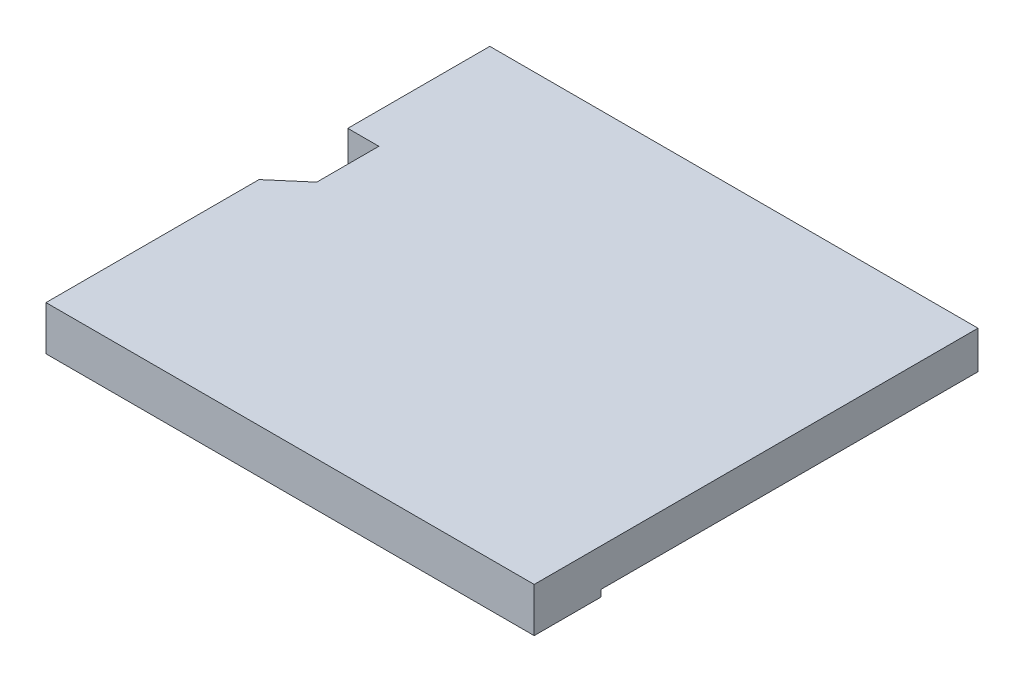
ISO-10303-21;
HEADER;
FILE_DESCRIPTION(('STEP AP214'),'2;1');
FILE_NAME('part.step','',(''),(''),'','','');
FILE_SCHEMA(('AUTOMOTIVE_DESIGN { 1 0 10303 214 1 1 1 1 }'));
ENDSEC;
DATA;
#1=APPLICATION_CONTEXT('core data for automotive mechanical design processes');
#2=APPLICATION_PROTOCOL_DEFINITION('international standard','automotive_design',2000,#1);
#3=PRODUCT_CONTEXT('',#1,'mechanical');
#4=PRODUCT('Part','Part','',(#3));
#5=PRODUCT_RELATED_PRODUCT_CATEGORY('part','',(#4));
#6=PRODUCT_DEFINITION_FORMATION('','',#4);
#7=PRODUCT_DEFINITION_CONTEXT('part definition',#1,'design');
#8=PRODUCT_DEFINITION('design','',#6,#7);
#9=PRODUCT_DEFINITION_SHAPE('','',#8);
#10=(LENGTH_UNIT() NAMED_UNIT(*) SI_UNIT(.MILLI.,.METRE.));
#11=(NAMED_UNIT(*) PLANE_ANGLE_UNIT() SI_UNIT($,.RADIAN.));
#12=(NAMED_UNIT(*) SI_UNIT($,.STERADIAN.) SOLID_ANGLE_UNIT());
#13=UNCERTAINTY_MEASURE_WITH_UNIT(LENGTH_MEASURE(1.E-05),#10,'distance_accuracy_value','');
#14=(GEOMETRIC_REPRESENTATION_CONTEXT(3) GLOBAL_UNCERTAINTY_ASSIGNED_CONTEXT((#13)) GLOBAL_UNIT_ASSIGNED_CONTEXT((#10,
#11,#12)) REPRESENTATION_CONTEXT('',''));
#15=CARTESIAN_POINT('',(0.,0.,0.));
#16=DIRECTION('',(0.,0.,1.));
#17=DIRECTION('',(1.,0.,0.));
#18=AXIS2_PLACEMENT_3D('',#15,#16,#17);
#19=CARTESIAN_POINT('',(-4.924999678405,-3.164426964218,10.));
#20=DIRECTION('',(0.,1.,0.));
#21=DIRECTION('',(0.,0.,1.));
#22=AXIS2_PLACEMENT_3D('',#19,#20,#21);
#23=PLANE('',#22);
#24=CARTESIAN_POINT('',(-0.574999732976,-3.164426964218,68.8750000000001));
#25=DIRECTION('',(0.,-1.,0.));
#26=DIRECTION('',(0.,0.,-1.));
#27=AXIS2_PLACEMENT_3D('',#24,#25,#26);
#28=CIRCLE('',#27,60.6250000000001);
#29=CARTESIAN_POINT('',(-6.074999732976,-3.164426964218,8.5));
#30=VERTEX_POINT('',#29);
#31=CARTESIAN_POINT('',(4.925000267024,-3.164426964218,8.5));
#32=VERTEX_POINT('',#31);
#33=EDGE_CURVE('E61',#30,#32,#28,.T.);
#34=ORIENTED_EDGE('',*,*,#33,.F.);
#35=DIRECTION('',(0.,0.,-1.));
#36=VECTOR('',#35,1.);
#37=CARTESIAN_POINT('',(-6.074999732976,-3.164426964218,0.));
#38=LINE('',#37,#36);
#39=CARTESIAN_POINT('',(-6.074999732976,-3.164426964218,5.2));
#40=VERTEX_POINT('',#39);
#41=EDGE_CURVE('E165',#30,#40,#38,.T.);
#42=ORIENTED_EDGE('',*,*,#41,.T.);
#43=DIRECTION('',(0.759256602365296,0.,-0.650791373455969));
#44=VECTOR('',#43,1.);
#45=CARTESIAN_POINT('',(-0.00352929867219089,-3.164426964218,-0.00411751511755603));
#46=LINE('',#45,#44);
#47=CARTESIAN_POINT('',(-5.374999732976,-3.164426964218,4.6));
#48=VERTEX_POINT('',#47);
#49=EDGE_CURVE('E198',#40,#48,#46,.T.);
#50=ORIENTED_EDGE('',*,*,#49,.T.);
#51=DIRECTION('',(0.,0.,-1.));
#52=VECTOR('',#51,1.);
#53=CARTESIAN_POINT('',(-5.374999732976,-3.164426964218,0.));
#54=LINE('',#53,#52);
#55=CARTESIAN_POINT('',(-5.374999732976,-3.164426964218,3.2));
#56=VERTEX_POINT('',#55);
#57=EDGE_CURVE('E202',#48,#56,#54,.T.);
#58=ORIENTED_EDGE('',*,*,#57,.T.);
#59=DIRECTION('',(-1.,0.,0.));
#60=VECTOR('',#59,1.);
#61=CARTESIAN_POINT('',(0.,-3.164426964218,3.2));
#62=LINE('',#61,#60);
#63=CARTESIAN_POINT('',(-6.074999732976,-3.164426964218,3.2));
#64=VERTEX_POINT('',#63);
#65=EDGE_CURVE('E206',#56,#64,#62,.T.);
#66=ORIENTED_EDGE('',*,*,#65,.T.);
#67=DIRECTION('',(0.,0.,-1.));
#68=VECTOR('',#67,1.);
#69=CARTESIAN_POINT('',(-6.074999732976,-3.164426964218,0.));
#70=LINE('',#69,#68);
#71=CARTESIAN_POINT('',(-6.074999732976,-3.164426964218,0.));
#72=VERTEX_POINT('',#71);
#73=EDGE_CURVE('E160',#64,#72,#70,.T.);
#74=ORIENTED_EDGE('',*,*,#73,.T.);
#75=DIRECTION('',(1.,0.,0.));
#76=VECTOR('',#75,1.);
#77=CARTESIAN_POINT('',(-4.924999678405,-3.164426964218,0.));
#78=LINE('',#77,#76);
#79=CARTESIAN_POINT('',(4.925000267024,-3.164426964218,0.));
#80=VERTEX_POINT('',#79);
#81=EDGE_CURVE('E194',#72,#80,#78,.T.);
#82=ORIENTED_EDGE('',*,*,#81,.T.);
#83=DIRECTION('',(0.,0.,-1.));
#84=VECTOR('',#83,1.);
#85=CARTESIAN_POINT('',(4.925000267024,-3.164426964218,10.));
#86=LINE('',#85,#84);
#87=EDGE_CURVE('E12',#32,#80,#86,.T.);
#88=ORIENTED_EDGE('',*,*,#87,.F.);
#89=EDGE_LOOP('',(#34,#42,#50,#58,#66,#74,#82,#88));
#90=FACE_BOUND('',#89,.T.);
#91=ADVANCED_FACE('F43',(#90),#23,.F.);
#92=CARTESIAN_POINT('',(4.925000267024,-2.314426968928,10.));
#93=DIRECTION('',(-1.,0.,0.));
#94=DIRECTION('',(0.,0.,1.));
#95=AXIS2_PLACEMENT_3D('',#92,#93,#94);
#96=PLANE('',#95);
#97=DIRECTION('',(0.,1.,0.));
#98=VECTOR('',#97,1.);
#99=CARTESIAN_POINT('',(4.925000267024,-2.314426968928,0.));
#100=LINE('',#99,#98);
#101=CARTESIAN_POINT('',(4.925000267024,-2.314426968928,0.));
#102=VERTEX_POINT('',#101);
#103=EDGE_CURVE('E232',#80,#102,#100,.T.);
#104=ORIENTED_EDGE('',*,*,#103,.T.);
#105=DIRECTION('',(0.,0.,-1.));
#106=VECTOR('',#105,1.);
#107=CARTESIAN_POINT('',(4.925000267024,-2.314426968928,10.));
#108=LINE('',#107,#106);
#109=CARTESIAN_POINT('',(4.925000267024,-2.314426968928,10.));
#110=VERTEX_POINT('',#109);
#111=EDGE_CURVE('E51',#110,#102,#108,.T.);
#112=ORIENTED_EDGE('',*,*,#111,.F.);
#113=DIRECTION('',(0.,1.,0.));
#114=VECTOR('',#113,1.);
#115=CARTESIAN_POINT('',(4.925000267024,-2.314426968928,10.));
#116=LINE('',#115,#114);
#117=CARTESIAN_POINT('',(4.925000267024,-3.314426968928,10.));
#118=VERTEX_POINT('',#117);
#119=EDGE_CURVE('E70',#118,#110,#116,.T.);
#120=ORIENTED_EDGE('',*,*,#119,.F.);
#121=DIRECTION('',(0.,0.,1.));
#122=VECTOR('',#121,1.);
#123=CARTESIAN_POINT('',(4.925000267024,-3.314426968928,8.5));
#124=LINE('',#123,#122);
#125=CARTESIAN_POINT('',(4.925000267024,-3.314426968928,8.5));
#126=VERTEX_POINT('',#125);
#127=EDGE_CURVE('E139',#126,#118,#124,.T.);
#128=ORIENTED_EDGE('',*,*,#127,.F.);
#129=DIRECTION('',(0.,1.,0.));
#130=VECTOR('',#129,1.);
#131=CARTESIAN_POINT('',(4.925000267024,-15.4527616739008,8.5));
#132=LINE('',#131,#130);
#133=EDGE_CURVE('E154',#126,#32,#132,.T.);
#134=ORIENTED_EDGE('',*,*,#133,.T.);
#135=ORIENTED_EDGE('',*,*,#87,.T.);
#136=EDGE_LOOP('',(#104,#112,#120,#128,#134,#135));
#137=FACE_BOUND('',#136,.T.);
#138=ADVANCED_FACE('F137',(#137),#96,.F.);
#139=CARTESIAN_POINT('',(-4.924999678405,-2.314426968928,10.));
#140=DIRECTION('',(0.,-1.,0.));
#141=DIRECTION('',(0.,0.,-1.));
#142=AXIS2_PLACEMENT_3D('',#139,#140,#141);
#143=PLANE('',#142);
#144=DIRECTION('',(-1.,0.,0.));
#145=VECTOR('',#144,1.);
#146=CARTESIAN_POINT('',(-4.924999678405,-2.314426968928,0.));
#147=LINE('',#146,#145);
#148=CARTESIAN_POINT('',(-6.074999732976,-2.314426968928,0.));
#149=VERTEX_POINT('',#148);
#150=EDGE_CURVE('E142',#102,#149,#147,.T.);
#151=ORIENTED_EDGE('',*,*,#150,.T.);
#152=DIRECTION('',(0.,0.,1.));
#153=VECTOR('',#152,1.);
#154=CARTESIAN_POINT('',(-6.074999732976,-2.314426968928,0.));
#155=LINE('',#154,#153);
#156=CARTESIAN_POINT('',(-6.074999732976,-2.314426968928,3.2));
#157=VERTEX_POINT('',#156);
#158=EDGE_CURVE('E191',#149,#157,#155,.T.);
#159=ORIENTED_EDGE('',*,*,#158,.T.);
#160=DIRECTION('',(1.,0.,0.));
#161=VECTOR('',#160,1.);
#162=CARTESIAN_POINT('',(0.,-2.314426968928,3.2));
#163=LINE('',#162,#161);
#164=CARTESIAN_POINT('',(-5.374999732976,-2.314426968928,3.2));
#165=VERTEX_POINT('',#164);
#166=EDGE_CURVE('E188',#157,#165,#163,.T.);
#167=ORIENTED_EDGE('',*,*,#166,.T.);
#168=DIRECTION('',(0.,0.,1.));
#169=VECTOR('',#168,1.);
#170=CARTESIAN_POINT('',(-5.374999732976,-2.314426968928,0.));
#171=LINE('',#170,#169);
#172=CARTESIAN_POINT('',(-5.374999732976,-2.314426968928,4.6));
#173=VERTEX_POINT('',#172);
#174=EDGE_CURVE('E185',#165,#173,#171,.T.);
#175=ORIENTED_EDGE('',*,*,#174,.T.);
#176=DIRECTION('',(-0.759256602365296,0.,0.650791373455969));
#177=VECTOR('',#176,1.);
#178=CARTESIAN_POINT('',(-0.00352929867219089,-2.314426968928,-0.00411751511755603));
#179=LINE('',#178,#177);
#180=CARTESIAN_POINT('',(-6.074999732976,-2.314426968928,5.2));
#181=VERTEX_POINT('',#180);
#182=EDGE_CURVE('E181',#173,#181,#179,.T.);
#183=ORIENTED_EDGE('',*,*,#182,.T.);
#184=DIRECTION('',(0.,0.,1.));
#185=VECTOR('',#184,1.);
#186=CARTESIAN_POINT('',(-6.074999732976,-2.314426968928,0.));
#187=LINE('',#186,#185);
#188=CARTESIAN_POINT('',(-6.074999732976,-2.314426968928,10.));
#189=VERTEX_POINT('',#188);
#190=EDGE_CURVE('E178',#181,#189,#187,.T.);
#191=ORIENTED_EDGE('',*,*,#190,.T.);
#192=DIRECTION('',(-1.,0.,0.));
#193=VECTOR('',#192,1.);
#194=CARTESIAN_POINT('',(-4.924999678405,-2.314426968928,10.));
#195=LINE('',#194,#193);
#196=EDGE_CURVE('E88',#110,#189,#195,.T.);
#197=ORIENTED_EDGE('',*,*,#196,.F.);
#198=ORIENTED_EDGE('',*,*,#111,.T.);
#199=EDGE_LOOP('',(#151,#159,#167,#175,#183,#191,#197,#198));
#200=FACE_BOUND('',#199,.T.);
#201=ADVANCED_FACE('F239',(#200),#143,.F.);
#202=CARTESIAN_POINT('',(0.,0.,10.));
#203=DIRECTION('',(0.,0.,1.));
#204=DIRECTION('',(1.,0.,0.));
#205=AXIS2_PLACEMENT_3D('',#202,#203,#204);
#206=PLANE('',#205);
#207=ORIENTED_EDGE('',*,*,#196,.T.);
#208=DIRECTION('',(0.,-1.,0.));
#209=VECTOR('',#208,1.);
#210=CARTESIAN_POINT('',(-6.074999732976,7.75148084534853,10.));
#211=LINE('',#210,#209);
#212=CARTESIAN_POINT('',(-6.074999732976,-3.314426968928,10.));
#213=VERTEX_POINT('',#212);
#214=EDGE_CURVE('E148',#189,#213,#211,.T.);
#215=ORIENTED_EDGE('',*,*,#214,.T.);
#216=DIRECTION('',(-1.,0.,0.));
#217=VECTOR('',#216,1.);
#218=CARTESIAN_POINT('',(-6.074999732976,-3.314426968928,10.));
#219=LINE('',#218,#217);
#220=EDGE_CURVE('E145',#118,#213,#219,.T.);
#221=ORIENTED_EDGE('',*,*,#220,.F.);
#222=ORIENTED_EDGE('',*,*,#119,.T.);
#223=EDGE_LOOP('',(#207,#215,#221,#222));
#224=FACE_BOUND('',#223,.T.);
#225=ADVANCED_FACE('F146',(#224),#206,.T.);
#226=CARTESIAN_POINT('',(0.,0.,0.));
#227=DIRECTION('',(0.,0.,1.));
#228=DIRECTION('',(1.,0.,0.));
#229=AXIS2_PLACEMENT_3D('',#226,#227,#228);
#230=PLANE('',#229);
#231=ORIENTED_EDGE('',*,*,#81,.F.);
#232=DIRECTION('',(0.,-1.,0.));
#233=VECTOR('',#232,1.);
#234=CARTESIAN_POINT('',(-6.074999732976,7.75148084534853,0.));
#235=LINE('',#234,#233);
#236=EDGE_CURVE('E210',#149,#72,#235,.T.);
#237=ORIENTED_EDGE('',*,*,#236,.F.);
#238=ORIENTED_EDGE('',*,*,#150,.F.);
#239=ORIENTED_EDGE('',*,*,#103,.F.);
#240=EDGE_LOOP('',(#231,#237,#238,#239));
#241=FACE_BOUND('',#240,.T.);
#242=ADVANCED_FACE('F244',(#241),#230,.F.);
#243=CARTESIAN_POINT('',(-6.074999732976,7.75148084534853,0.));
#244=DIRECTION('',(-1.,0.,0.));
#245=DIRECTION('',(0.,0.,1.));
#246=AXIS2_PLACEMENT_3D('',#243,#244,#245);
#247=PLANE('',#246);
#248=ORIENTED_EDGE('',*,*,#158,.F.);
#249=ORIENTED_EDGE('',*,*,#236,.T.);
#250=ORIENTED_EDGE('',*,*,#73,.F.);
#251=DIRECTION('',(0.,-1.,0.));
#252=VECTOR('',#251,1.);
#253=CARTESIAN_POINT('',(-6.074999732976,7.75148084534853,3.2));
#254=LINE('',#253,#252);
#255=EDGE_CURVE('E182',#157,#64,#254,.T.);
#256=ORIENTED_EDGE('',*,*,#255,.F.);
#257=EDGE_LOOP('',(#248,#249,#250,#256));
#258=FACE_BOUND('',#257,.T.);
#259=ADVANCED_FACE('F247',(#258),#247,.T.);
#260=CARTESIAN_POINT('',(0.,7.75148084534853,3.2));
#261=DIRECTION('',(0.,0.,1.));
#262=DIRECTION('',(1.,0.,0.));
#263=AXIS2_PLACEMENT_3D('',#260,#261,#262);
#264=PLANE('',#263);
#265=ORIENTED_EDGE('',*,*,#166,.F.);
#266=ORIENTED_EDGE('',*,*,#255,.T.);
#267=ORIENTED_EDGE('',*,*,#65,.F.);
#268=DIRECTION('',(0.,-1.,0.));
#269=VECTOR('',#268,1.);
#270=CARTESIAN_POINT('',(-5.374999732976,7.75148084534853,3.2));
#271=LINE('',#270,#269);
#272=EDGE_CURVE('E213',#165,#56,#271,.T.);
#273=ORIENTED_EDGE('',*,*,#272,.F.);
#274=EDGE_LOOP('',(#265,#266,#267,#273));
#275=FACE_BOUND('',#274,.T.);
#276=ADVANCED_FACE('F254',(#275),#264,.T.);
#277=CARTESIAN_POINT('',(-5.374999732976,7.75148084534853,0.));
#278=DIRECTION('',(-1.,0.,0.));
#279=DIRECTION('',(0.,0.,1.));
#280=AXIS2_PLACEMENT_3D('',#277,#278,#279);
#281=PLANE('',#280);
#282=ORIENTED_EDGE('',*,*,#174,.F.);
#283=ORIENTED_EDGE('',*,*,#272,.T.);
#284=ORIENTED_EDGE('',*,*,#57,.F.);
#285=DIRECTION('',(0.,-1.,0.));
#286=VECTOR('',#285,1.);
#287=CARTESIAN_POINT('',(-5.374999732976,7.75148084534853,4.6));
#288=LINE('',#287,#286);
#289=EDGE_CURVE('E216',#173,#48,#288,.T.);
#290=ORIENTED_EDGE('',*,*,#289,.F.);
#291=EDGE_LOOP('',(#282,#283,#284,#290));
#292=FACE_BOUND('',#291,.T.);
#293=ADVANCED_FACE('F260',(#292),#281,.T.);
#294=CARTESIAN_POINT('',(-0.00352929867219089,7.75148084534853,-0.00411751511755603));
#295=DIRECTION('',(-0.650791373455969,0.,-0.759256602365296));
#296=DIRECTION('',(-0.759256602365296,0.,0.650791373455969));
#297=AXIS2_PLACEMENT_3D('',#294,#295,#296);
#298=PLANE('',#297);
#299=ORIENTED_EDGE('',*,*,#182,.F.);
#300=ORIENTED_EDGE('',*,*,#289,.T.);
#301=ORIENTED_EDGE('',*,*,#49,.F.);
#302=DIRECTION('',(0.,-1.,0.));
#303=VECTOR('',#302,1.);
#304=CARTESIAN_POINT('',(-6.074999732976,7.75148084534853,5.2));
#305=LINE('',#304,#303);
#306=EDGE_CURVE('E219',#181,#40,#305,.T.);
#307=ORIENTED_EDGE('',*,*,#306,.F.);
#308=EDGE_LOOP('',(#299,#300,#301,#307));
#309=FACE_BOUND('',#308,.T.);
#310=ADVANCED_FACE('F263',(#309),#298,.T.);
#311=CARTESIAN_POINT('',(-6.074999732976,7.75148084534853,0.));
#312=DIRECTION('',(-1.,0.,0.));
#313=DIRECTION('',(0.,0.,1.));
#314=AXIS2_PLACEMENT_3D('',#311,#312,#313);
#315=PLANE('',#314);
#316=ORIENTED_EDGE('',*,*,#190,.F.);
#317=ORIENTED_EDGE('',*,*,#306,.T.);
#318=ORIENTED_EDGE('',*,*,#41,.F.);
#319=DIRECTION('',(0.,1.,0.));
#320=VECTOR('',#319,1.);
#321=CARTESIAN_POINT('',(-6.07499973297602,-15.4527616739008,8.5));
#322=LINE('',#321,#320);
#323=CARTESIAN_POINT('',(-6.07499973297602,-3.314426968928,8.5));
#324=VERTEX_POINT('',#323);
#325=EDGE_CURVE('E173',#324,#30,#322,.T.);
#326=ORIENTED_EDGE('',*,*,#325,.F.);
#327=DIRECTION('',(0.,0.,-1.));
#328=VECTOR('',#327,1.);
#329=CARTESIAN_POINT('',(-6.074999732976,-3.314426968928,10.));
#330=LINE('',#329,#328);
#331=EDGE_CURVE('E153',#213,#324,#330,.T.);
#332=ORIENTED_EDGE('',*,*,#331,.F.);
#333=ORIENTED_EDGE('',*,*,#214,.F.);
#334=EDGE_LOOP('',(#316,#317,#318,#326,#332,#333));
#335=FACE_BOUND('',#334,.T.);
#336=ADVANCED_FACE('F267',(#335),#315,.T.);
#337=CARTESIAN_POINT('',(-0.574999732976,-15.4527616739008,68.8750000000001));
#338=DIRECTION('',(0.,1.,0.));
#339=DIRECTION('',(0.,0.,1.));
#340=AXIS2_PLACEMENT_3D('',#337,#338,#339);
#341=CYLINDRICAL_SURFACE('',#340,60.6250000000001);
#342=CARTESIAN_POINT('',(-0.574999732976,-3.314426968928,68.8750000000001));
#343=DIRECTION('',(0.,-1.,0.));
#344=DIRECTION('',(0.,0.,-1.));
#345=AXIS2_PLACEMENT_3D('',#342,#343,#344);
#346=CIRCLE('',#345,60.6250000000001);
#347=EDGE_CURVE('E158',#324,#126,#346,.T.);
#348=ORIENTED_EDGE('',*,*,#347,.F.);
#349=ORIENTED_EDGE('',*,*,#325,.T.);
#350=ORIENTED_EDGE('',*,*,#33,.T.);
#351=ORIENTED_EDGE('',*,*,#133,.F.);
#352=EDGE_LOOP('',(#348,#349,#350,#351));
#353=FACE_BOUND('',#352,.T.);
#354=ADVANCED_FACE('F270',(#353),#341,.T.);
#355=CARTESIAN_POINT('',(-4.924999678405,-3.314426968928,10.));
#356=DIRECTION('',(0.,-1.,0.));
#357=DIRECTION('',(0.,0.,-1.));
#358=AXIS2_PLACEMENT_3D('',#355,#356,#357);
#359=PLANE('',#358);
#360=ORIENTED_EDGE('',*,*,#220,.T.);
#361=ORIENTED_EDGE('',*,*,#331,.T.);
#362=ORIENTED_EDGE('',*,*,#347,.T.);
#363=ORIENTED_EDGE('',*,*,#127,.T.);
#364=EDGE_LOOP('',(#360,#361,#362,#363));
#365=FACE_BOUND('',#364,.T.);
#366=ADVANCED_FACE('F157',(#365),#359,.T.);
#367=CLOSED_SHELL('',(#91,#138,#201,#225,#242,#259,#276,#293,#310,#336,#354,#366));
#368=MANIFOLD_SOLID_BREP('B2',#367);
#369=ADVANCED_BREP_SHAPE_REPRESENTATION('',(#18,#368),#14);
#370=SHAPE_DEFINITION_REPRESENTATION(#9,#369);
ENDSEC;
END-ISO-10303-21;
